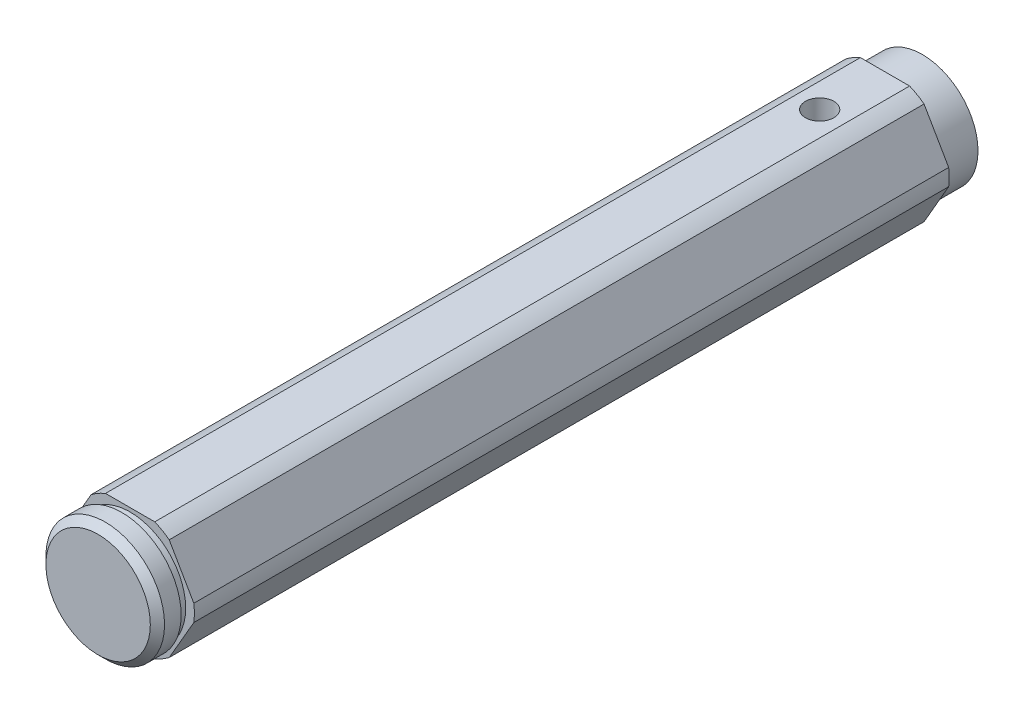
ISO-10303-21;
HEADER;
FILE_DESCRIPTION(('STEP AP214'),'2;1');
FILE_NAME('part.step','',(''),(''),'','','');
FILE_SCHEMA(('AUTOMOTIVE_DESIGN { 1 0 10303 214 1 1 1 1 }'));
ENDSEC;
DATA;
#1=APPLICATION_CONTEXT('core data for automotive mechanical design processes');
#2=APPLICATION_PROTOCOL_DEFINITION('international standard','automotive_design',2000,#1);
#3=PRODUCT_CONTEXT('',#1,'mechanical');
#4=PRODUCT('Part','Part','',(#3));
#5=PRODUCT_RELATED_PRODUCT_CATEGORY('part','',(#4));
#6=PRODUCT_DEFINITION_FORMATION('','',#4);
#7=PRODUCT_DEFINITION_CONTEXT('part definition',#1,'design');
#8=PRODUCT_DEFINITION('design','',#6,#7);
#9=PRODUCT_DEFINITION_SHAPE('','',#8);
#10=(LENGTH_UNIT() NAMED_UNIT(*) SI_UNIT(.MILLI.,.METRE.));
#11=(NAMED_UNIT(*) PLANE_ANGLE_UNIT() SI_UNIT($,.RADIAN.));
#12=(NAMED_UNIT(*) SI_UNIT($,.STERADIAN.) SOLID_ANGLE_UNIT());
#13=UNCERTAINTY_MEASURE_WITH_UNIT(LENGTH_MEASURE(1.E-05),#10,'distance_accuracy_value','');
#14=(GEOMETRIC_REPRESENTATION_CONTEXT(3) GLOBAL_UNCERTAINTY_ASSIGNED_CONTEXT((#13)) GLOBAL_UNIT_ASSIGNED_CONTEXT((#10,
#11,#12)) REPRESENTATION_CONTEXT('',''));
#15=CARTESIAN_POINT('',(0.,0.,0.));
#16=DIRECTION('',(0.,0.,1.));
#17=DIRECTION('',(1.,0.,0.));
#18=AXIS2_PLACEMENT_3D('',#15,#16,#17);
#19=CARTESIAN_POINT('',(0.,0.,7.99846));
#20=DIRECTION('',(0.,0.,-1.));
#21=DIRECTION('',(-1.,0.,0.));
#22=AXIS2_PLACEMENT_3D('',#19,#20,#21);
#23=PLANE('',#22);
#24=DIRECTION('',(0.,-1.,0.));
#25=VECTOR('',#24,1.);
#26=CARTESIAN_POINT('',(1.14402888188412,-6.34999999999999,7.99846));
#27=LINE('',#26,#25);
#28=CARTESIAN_POINT('',(1.14402888188412,3.57155750527903,7.99846));
#29=VERTEX_POINT('',#28);
#30=CARTESIAN_POINT('',(1.14402888188412,-3.57155750527903,7.99846));
#31=VERTEX_POINT('',#30);
#32=EDGE_CURVE('E140',#29,#31,#27,.T.);
#33=ORIENTED_EDGE('',*,*,#32,.F.);
#34=CARTESIAN_POINT('',(0.,0.,7.99846));
#35=DIRECTION('',(0.,0.,-1.));
#36=DIRECTION('',(-1.,0.,0.));
#37=AXIS2_PLACEMENT_3D('',#34,#35,#36);
#38=CIRCLE('',#37,3.75031);
#39=EDGE_CURVE('E148',#29,#31,#38,.T.);
#40=ORIENTED_EDGE('',*,*,#39,.T.);
#41=EDGE_LOOP('',(#33,#40));
#42=FACE_BOUND('',#41,.T.);
#43=ADVANCED_FACE('F35',(#42),#23,.T.);
#44=CARTESIAN_POINT('',(0.,0.,0.));
#45=DIRECTION('',(0.,0.,1.));
#46=DIRECTION('',(1.,0.,0.));
#47=AXIS2_PLACEMENT_3D('',#44,#45,#46);
#48=PLANE('',#47);
#49=DIRECTION('',(0.499999999999995,0.866025403784442,0.));
#50=VECTOR('',#49,1.);
#51=CARTESIAN_POINT('',(-3.66617420935415,6.34999999999997,0.));
#52=LINE('',#51,#50);
#53=CARTESIAN_POINT('',(-6.816751826331,0.893039494206721,0.));
#54=VERTEX_POINT('',#53);
#55=CARTESIAN_POINT('',(-4.18177080173139,5.4569605057932,0.));
#56=VERTEX_POINT('',#55);
#57=EDGE_CURVE('E199',#54,#56,#52,.T.);
#58=ORIENTED_EDGE('',*,*,#57,.T.);
#59=CARTESIAN_POINT('',(0.,0.,0.));
#60=DIRECTION('',(0.,0.,1.));
#61=DIRECTION('',(1.,0.,0.));
#62=AXIS2_PLACEMENT_3D('',#59,#60,#61);
#63=CIRCLE('',#62,6.875);
#64=CARTESIAN_POINT('',(-2.63498102459964,6.34999999999999,0.));
#65=VERTEX_POINT('',#64);
#66=EDGE_CURVE('E229',#65,#56,#63,.T.);
#67=ORIENTED_EDGE('',*,*,#66,.F.);
#68=DIRECTION('',(1.,0.,0.));
#69=VECTOR('',#68,1.);
#70=CARTESIAN_POINT('',(0.,6.35,0.));
#71=LINE('',#70,#69);
#72=CARTESIAN_POINT('',(2.63498102459961,6.35,0.));
#73=VERTEX_POINT('',#72);
#74=EDGE_CURVE('E205',#73,#65,#71,.F.);
#75=ORIENTED_EDGE('',*,*,#74,.F.);
#76=CARTESIAN_POINT('',(0.,0.,0.));
#77=DIRECTION('',(0.,0.,1.));
#78=DIRECTION('',(1.,0.,0.));
#79=AXIS2_PLACEMENT_3D('',#76,#77,#78);
#80=CIRCLE('',#79,6.875);
#81=CARTESIAN_POINT('',(4.18177080173135,5.45696050579323,0.));
#82=VERTEX_POINT('',#81);
#83=EDGE_CURVE('E209',#82,#73,#80,.T.);
#84=ORIENTED_EDGE('',*,*,#83,.F.);
#85=DIRECTION('',(-0.500000000000001,0.866025403784438,0.));
#86=VECTOR('',#85,1.);
#87=CARTESIAN_POINT('',(6.81675182633099,0.893039494206768,0.));
#88=LINE('',#87,#86);
#89=CARTESIAN_POINT('',(6.81675182633099,0.893039494206768,0.));
#90=VERTEX_POINT('',#89);
#91=EDGE_CURVE('E210',#90,#82,#88,.T.);
#92=ORIENTED_EDGE('',*,*,#91,.F.);
#93=CARTESIAN_POINT('',(0.,0.,0.));
#94=DIRECTION('',(0.,0.,1.));
#95=DIRECTION('',(1.,0.,0.));
#96=AXIS2_PLACEMENT_3D('',#93,#94,#95);
#97=CIRCLE('',#96,6.875);
#98=CARTESIAN_POINT('',(6.81675182633099,-0.893039494206785,0.));
#99=VERTEX_POINT('',#98);
#100=EDGE_CURVE('E194',#99,#90,#97,.T.);
#101=ORIENTED_EDGE('',*,*,#100,.F.);
#102=DIRECTION('',(0.499999999999995,0.866025403784442,0.));
#103=VECTOR('',#102,1.);
#104=CARTESIAN_POINT('',(4.18177080173144,-5.45696050579316,0.));
#105=LINE('',#104,#103);
#106=CARTESIAN_POINT('',(4.18177080173144,-5.45696050579316,0.));
#107=VERTEX_POINT('',#106);
#108=EDGE_CURVE('E213',#107,#99,#105,.T.);
#109=ORIENTED_EDGE('',*,*,#108,.F.);
#110=CARTESIAN_POINT('',(0.,0.,0.));
#111=DIRECTION('',(0.,0.,1.));
#112=DIRECTION('',(1.,0.,0.));
#113=AXIS2_PLACEMENT_3D('',#110,#111,#112);
#114=CIRCLE('',#113,6.875);
#115=CARTESIAN_POINT('',(2.63498102459963,-6.34999999999999,0.));
#116=VERTEX_POINT('',#115);
#117=EDGE_CURVE('E216',#116,#107,#114,.T.);
#118=ORIENTED_EDGE('',*,*,#117,.F.);
#119=DIRECTION('',(1.,0.,0.));
#120=VECTOR('',#119,1.);
#121=CARTESIAN_POINT('',(0.,-6.35000000000002,0.));
#122=LINE('',#121,#120);
#123=CARTESIAN_POINT('',(-2.63498102459956,-6.35000000000002,0.));
#124=VERTEX_POINT('',#123);
#125=EDGE_CURVE('E217',#124,#116,#122,.T.);
#126=ORIENTED_EDGE('',*,*,#125,.F.);
#127=CARTESIAN_POINT('',(0.,0.,0.));
#128=DIRECTION('',(0.,0.,1.));
#129=DIRECTION('',(1.,0.,0.));
#130=AXIS2_PLACEMENT_3D('',#127,#128,#129);
#131=CIRCLE('',#130,6.875);
#132=CARTESIAN_POINT('',(-4.18177080173132,-5.45696050579325,0.));
#133=VERTEX_POINT('',#132);
#134=EDGE_CURVE('E220',#133,#124,#131,.T.);
#135=ORIENTED_EDGE('',*,*,#134,.F.);
#136=DIRECTION('',(0.500000000000007,-0.866025403784434,0.));
#137=VECTOR('',#136,1.);
#138=CARTESIAN_POINT('',(-6.81675182633098,-0.893039494206822,0.));
#139=LINE('',#138,#137);
#140=CARTESIAN_POINT('',(-6.81675182633098,-0.893039494206821,0.));
#141=VERTEX_POINT('',#140);
#142=EDGE_CURVE('E221',#141,#133,#139,.T.);
#143=ORIENTED_EDGE('',*,*,#142,.F.);
#144=CARTESIAN_POINT('',(0.,0.,0.));
#145=DIRECTION('',(0.,0.,1.));
#146=DIRECTION('',(1.,0.,0.));
#147=AXIS2_PLACEMENT_3D('',#144,#145,#146);
#148=CIRCLE('',#147,6.875);
#149=EDGE_CURVE('E227',#54,#141,#148,.T.);
#150=ORIENTED_EDGE('',*,*,#149,.F.);
#151=EDGE_LOOP('',(#58,#67,#75,#84,#92,#101,#109,#118,#126,#135,#143,#150));
#152=FACE_BOUND('',#151,.T.);
#153=CARTESIAN_POINT('',(0.,0.,0.));
#154=DIRECTION('',(0.,0.,1.));
#155=DIRECTION('',(1.,0.,0.));
#156=AXIS2_PLACEMENT_3D('',#153,#154,#155);
#157=CIRCLE('',#156,5.95503);
#158=CARTESIAN_POINT('',(5.95503,0.,0.));
#159=VERTEX_POINT('',#158);
#160=EDGE_CURVE('E145',#159,#159,#157,.F.);
#161=ORIENTED_EDGE('',*,*,#160,.F.);
#162=EDGE_LOOP('',(#161));
#163=FACE_BOUND('',#162,.T.);
#164=ADVANCED_FACE('F283',(#152,#163),#48,.F.);
#165=CARTESIAN_POINT('',(0.,0.,80.7974));
#166=DIRECTION('',(0.,0.,1.));
#167=DIRECTION('',(1.,0.,0.));
#168=AXIS2_PLACEMENT_3D('',#165,#166,#167);
#169=PLANE('',#168);
#170=CARTESIAN_POINT('',(0.,0.,80.7974));
#171=DIRECTION('',(0.,0.,1.));
#172=DIRECTION('',(1.,0.,0.));
#173=AXIS2_PLACEMENT_3D('',#170,#171,#172);
#174=CIRCLE('',#173,6.875);
#175=CARTESIAN_POINT('',(4.18177080173135,5.45696050579323,80.7974));
#176=VERTEX_POINT('',#175);
#177=CARTESIAN_POINT('',(2.63498102459961,6.35,80.7974));
#178=VERTEX_POINT('',#177);
#179=EDGE_CURVE('E169',#176,#178,#174,.T.);
#180=ORIENTED_EDGE('',*,*,#179,.T.);
#181=DIRECTION('',(-1.,0.,0.));
#182=VECTOR('',#181,1.);
#183=CARTESIAN_POINT('',(2.63498102459961,6.35,80.7974));
#184=LINE('',#183,#182);
#185=CARTESIAN_POINT('',(-2.63498102459964,6.34999999999999,80.7974));
#186=VERTEX_POINT('',#185);
#187=EDGE_CURVE('E173',#178,#186,#184,.T.);
#188=ORIENTED_EDGE('',*,*,#187,.T.);
#189=CARTESIAN_POINT('',(0.,0.,80.7974));
#190=DIRECTION('',(0.,0.,1.));
#191=DIRECTION('',(1.,0.,0.));
#192=AXIS2_PLACEMENT_3D('',#189,#190,#191);
#193=CIRCLE('',#192,6.875);
#194=CARTESIAN_POINT('',(-4.18177080173139,5.4569605057932,80.7974));
#195=VERTEX_POINT('',#194);
#196=EDGE_CURVE('E63',#186,#195,#193,.T.);
#197=ORIENTED_EDGE('',*,*,#196,.T.);
#198=DIRECTION('',(-0.499999999999995,-0.866025403784441,0.));
#199=VECTOR('',#198,1.);
#200=CARTESIAN_POINT('',(-4.18177080173139,5.4569605057932,80.7974));
#201=LINE('',#200,#199);
#202=CARTESIAN_POINT('',(-6.816751826331,0.893039494206721,80.7974));
#203=VERTEX_POINT('',#202);
#204=EDGE_CURVE('E176',#195,#203,#201,.T.);
#205=ORIENTED_EDGE('',*,*,#204,.T.);
#206=CARTESIAN_POINT('',(0.,0.,80.7974));
#207=DIRECTION('',(0.,0.,1.));
#208=DIRECTION('',(1.,0.,0.));
#209=AXIS2_PLACEMENT_3D('',#206,#207,#208);
#210=CIRCLE('',#209,6.875);
#211=CARTESIAN_POINT('',(-6.81675182633098,-0.893039494206818,80.7974));
#212=VERTEX_POINT('',#211);
#213=EDGE_CURVE('E178',#203,#212,#210,.T.);
#214=ORIENTED_EDGE('',*,*,#213,.T.);
#215=DIRECTION('',(0.500000000000007,-0.866025403784434,0.));
#216=VECTOR('',#215,1.);
#217=CARTESIAN_POINT('',(-6.81675182633098,-0.893039494206821,80.7974));
#218=LINE('',#217,#216);
#219=CARTESIAN_POINT('',(-4.18177080173132,-5.45696050579326,80.7974));
#220=VERTEX_POINT('',#219);
#221=EDGE_CURVE('E180',#212,#220,#218,.T.);
#222=ORIENTED_EDGE('',*,*,#221,.T.);
#223=CARTESIAN_POINT('',(0.,0.,80.7974));
#224=DIRECTION('',(0.,0.,1.));
#225=DIRECTION('',(1.,0.,0.));
#226=AXIS2_PLACEMENT_3D('',#223,#224,#225);
#227=CIRCLE('',#226,6.875);
#228=CARTESIAN_POINT('',(-2.63498102459957,-6.35000000000001,80.7974));
#229=VERTEX_POINT('',#228);
#230=EDGE_CURVE('E182',#220,#229,#227,.T.);
#231=ORIENTED_EDGE('',*,*,#230,.T.);
#232=DIRECTION('',(1.,0.,0.));
#233=VECTOR('',#232,1.);
#234=CARTESIAN_POINT('',(-2.63498102459957,-6.35000000000001,80.7974));
#235=LINE('',#234,#233);
#236=CARTESIAN_POINT('',(2.63498102459963,-6.34999999999999,80.7974));
#237=VERTEX_POINT('',#236);
#238=EDGE_CURVE('E184',#229,#237,#235,.T.);
#239=ORIENTED_EDGE('',*,*,#238,.T.);
#240=CARTESIAN_POINT('',(0.,0.,80.7974));
#241=DIRECTION('',(0.,0.,1.));
#242=DIRECTION('',(1.,0.,0.));
#243=AXIS2_PLACEMENT_3D('',#240,#241,#242);
#244=CIRCLE('',#243,6.875);
#245=CARTESIAN_POINT('',(4.18177080173144,-5.45696050579316,80.7974));
#246=VERTEX_POINT('',#245);
#247=EDGE_CURVE('E186',#237,#246,#244,.T.);
#248=ORIENTED_EDGE('',*,*,#247,.T.);
#249=DIRECTION('',(0.499999999999995,0.866025403784441,0.));
#250=VECTOR('',#249,1.);
#251=CARTESIAN_POINT('',(4.18177080173144,-5.45696050579316,80.7974));
#252=LINE('',#251,#250);
#253=CARTESIAN_POINT('',(6.81675182633099,-0.893039494206787,80.7974));
#254=VERTEX_POINT('',#253);
#255=EDGE_CURVE('E188',#246,#254,#252,.T.);
#256=ORIENTED_EDGE('',*,*,#255,.T.);
#257=CARTESIAN_POINT('',(0.,0.,80.7974));
#258=DIRECTION('',(0.,0.,1.));
#259=DIRECTION('',(1.,0.,0.));
#260=AXIS2_PLACEMENT_3D('',#257,#258,#259);
#261=CIRCLE('',#260,6.875);
#262=CARTESIAN_POINT('',(6.81675182633099,0.893039494206768,80.7974));
#263=VERTEX_POINT('',#262);
#264=EDGE_CURVE('E190',#254,#263,#261,.T.);
#265=ORIENTED_EDGE('',*,*,#264,.T.);
#266=DIRECTION('',(-0.500000000000001,0.866025403784438,0.));
#267=VECTOR('',#266,1.);
#268=CARTESIAN_POINT('',(6.81675182633099,0.893039494206768,80.7974));
#269=LINE('',#268,#267);
#270=EDGE_CURVE('E192',#263,#176,#269,.T.);
#271=ORIENTED_EDGE('',*,*,#270,.T.);
#272=EDGE_LOOP('',(#180,#188,#197,#205,#214,#222,#231,#239,#248,#256,#265,#271));
#273=FACE_BOUND('',#272,.T.);
#274=CARTESIAN_POINT('',(0.,0.,80.7974));
#275=DIRECTION('',(0.,0.,1.));
#276=DIRECTION('',(1.,0.,0.));
#277=AXIS2_PLACEMENT_3D('',#274,#275,#276);
#278=CIRCLE('',#277,5.9436);
#279=CARTESIAN_POINT('',(5.9436,0.,80.7974));
#280=VERTEX_POINT('',#279);
#281=EDGE_CURVE('E165',#280,#280,#278,.T.);
#282=ORIENTED_EDGE('',*,*,#281,.F.);
#283=EDGE_LOOP('',(#282));
#284=FACE_BOUND('',#283,.T.);
#285=ADVANCED_FACE('F289',(#273,#284),#169,.T.);
#286=CARTESIAN_POINT('',(0.,0.,0.));
#287=DIRECTION('',(0.,0.,1.));
#288=DIRECTION('',(1.,0.,0.));
#289=AXIS2_PLACEMENT_3D('',#286,#287,#288);
#290=CYLINDRICAL_SURFACE('',#289,6.875);
#291=DIRECTION('',(0.,0.,1.));
#292=VECTOR('',#291,1.);
#293=CARTESIAN_POINT('',(6.81675182633099,0.893039494206768,7.9375));
#294=LINE('',#293,#292);
#295=EDGE_CURVE('E235',#90,#263,#294,.T.);
#296=ORIENTED_EDGE('',*,*,#295,.T.);
#297=ORIENTED_EDGE('',*,*,#264,.F.);
#298=DIRECTION('',(0.,0.,1.));
#299=VECTOR('',#298,1.);
#300=CARTESIAN_POINT('',(6.81675182633099,-0.893039494206785,7.9375));
#301=LINE('',#300,#299);
#302=EDGE_CURVE('E241',#254,#99,#301,.F.);
#303=ORIENTED_EDGE('',*,*,#302,.T.);
#304=ORIENTED_EDGE('',*,*,#100,.T.);
#305=EDGE_LOOP('',(#296,#297,#303,#304));
#306=FACE_BOUND('',#305,.T.);
#307=ADVANCED_FACE('F295',(#306),#290,.T.);
#308=CARTESIAN_POINT('',(0.,0.,0.));
#309=DIRECTION('',(0.,0.,1.));
#310=DIRECTION('',(1.,0.,0.));
#311=AXIS2_PLACEMENT_3D('',#308,#309,#310);
#312=CYLINDRICAL_SURFACE('',#311,6.875);
#313=DIRECTION('',(0.,0.,1.));
#314=VECTOR('',#313,1.);
#315=CARTESIAN_POINT('',(-2.63498102459957,-6.35000000000001,7.9375));
#316=LINE('',#315,#314);
#317=EDGE_CURVE('E245',#124,#229,#316,.T.);
#318=ORIENTED_EDGE('',*,*,#317,.T.);
#319=ORIENTED_EDGE('',*,*,#230,.F.);
#320=DIRECTION('',(0.,0.,1.));
#321=VECTOR('',#320,1.);
#322=CARTESIAN_POINT('',(-4.18177080173132,-5.45696050579326,7.9375));
#323=LINE('',#322,#321);
#324=EDGE_CURVE('E224',#220,#133,#323,.F.);
#325=ORIENTED_EDGE('',*,*,#324,.T.);
#326=ORIENTED_EDGE('',*,*,#134,.T.);
#327=EDGE_LOOP('',(#318,#319,#325,#326));
#328=FACE_BOUND('',#327,.T.);
#329=ADVANCED_FACE('F329',(#328),#312,.T.);
#330=CARTESIAN_POINT('',(-3.66617420935406,-6.35000000000002,7.9375));
#331=DIRECTION('',(0.,1.,0.));
#332=DIRECTION('',(-1.,0.,0.));
#333=AXIS2_PLACEMENT_3D('',#330,#331,#332);
#334=PLANE('',#333);
#335=CARTESIAN_POINT('',(0.,-6.34999999999999,6.99159659446025));
#336=DIRECTION('',(0.,-1.,0.));
#337=DIRECTION('',(0.,0.,-1.));
#338=AXIS2_PLACEMENT_3D('',#335,#336,#337);
#339=CIRCLE('',#338,1.524);
#340=CARTESIAN_POINT('',(0.,-6.34999999999999,5.46759659446025));
#341=VERTEX_POINT('',#340);
#342=EDGE_CURVE('E561',#341,#341,#339,.T.);
#343=ORIENTED_EDGE('',*,*,#342,.F.);
#344=EDGE_LOOP('',(#343));
#345=FACE_BOUND('',#344,.T.);
#346=ORIENTED_EDGE('',*,*,#238,.F.);
#347=ORIENTED_EDGE('',*,*,#317,.F.);
#348=ORIENTED_EDGE('',*,*,#125,.T.);
#349=DIRECTION('',(0.,0.,1.));
#350=VECTOR('',#349,1.);
#351=CARTESIAN_POINT('',(2.6349810245997,-6.34999999999996,0.));
#352=LINE('',#351,#350);
#353=EDGE_CURVE('E243',#237,#116,#352,.F.);
#354=ORIENTED_EDGE('',*,*,#353,.F.);
#355=EDGE_LOOP('',(#346,#347,#348,#354));
#356=FACE_BOUND('',#355,.T.);
#357=ADVANCED_FACE('F325',(#345,#356),#334,.F.);
#358=CARTESIAN_POINT('',(0.,0.,0.));
#359=DIRECTION('',(0.,0.,1.));
#360=DIRECTION('',(1.,0.,0.));
#361=AXIS2_PLACEMENT_3D('',#358,#359,#360);
#362=CYLINDRICAL_SURFACE('',#361,6.875);
#363=DIRECTION('',(0.,0.,1.));
#364=VECTOR('',#363,1.);
#365=CARTESIAN_POINT('',(4.18177080173144,-5.45696050579316,7.9375));
#366=LINE('',#365,#364);
#367=EDGE_CURVE('E238',#107,#246,#366,.T.);
#368=ORIENTED_EDGE('',*,*,#367,.T.);
#369=ORIENTED_EDGE('',*,*,#247,.F.);
#370=ORIENTED_EDGE('',*,*,#353,.T.);
#371=ORIENTED_EDGE('',*,*,#117,.T.);
#372=EDGE_LOOP('',(#368,#369,#370,#371));
#373=FACE_BOUND('',#372,.T.);
#374=ADVANCED_FACE('F321',(#373),#362,.T.);
#375=CARTESIAN_POINT('',(3.66617420935419,-6.34999999999995,7.9375));
#376=DIRECTION('',(-0.866025403784441,0.499999999999995,0.));
#377=DIRECTION('',(-0.499999999999995,-0.866025403784441,0.));
#378=AXIS2_PLACEMENT_3D('',#375,#376,#377);
#379=PLANE('',#378);
#380=ORIENTED_EDGE('',*,*,#255,.F.);
#381=ORIENTED_EDGE('',*,*,#367,.F.);
#382=ORIENTED_EDGE('',*,*,#108,.T.);
#383=ORIENTED_EDGE('',*,*,#302,.F.);
#384=EDGE_LOOP('',(#380,#381,#382,#383));
#385=FACE_BOUND('',#384,.T.);
#386=ADVANCED_FACE('F317',(#385),#379,.F.);
#387=CARTESIAN_POINT('',(7.33234841870824,0.,7.9375));
#388=DIRECTION('',(-0.866025403784438,-0.500000000000001,0.));
#389=DIRECTION('',(0.500000000000001,-0.866025403784438,0.));
#390=AXIS2_PLACEMENT_3D('',#387,#388,#389);
#391=PLANE('',#390);
#392=ORIENTED_EDGE('',*,*,#270,.F.);
#393=ORIENTED_EDGE('',*,*,#295,.F.);
#394=ORIENTED_EDGE('',*,*,#91,.T.);
#395=DIRECTION('',(0.,0.,1.));
#396=VECTOR('',#395,1.);
#397=CARTESIAN_POINT('',(4.18177080173135,5.45696050579323,0.));
#398=LINE('',#397,#396);
#399=EDGE_CURVE('E233',#176,#82,#398,.F.);
#400=ORIENTED_EDGE('',*,*,#399,.F.);
#401=EDGE_LOOP('',(#392,#393,#394,#400));
#402=FACE_BOUND('',#401,.T.);
#403=ADVANCED_FACE('F313',(#402),#391,.F.);
#404=CARTESIAN_POINT('',(0.,0.,0.));
#405=DIRECTION('',(0.,0.,1.));
#406=DIRECTION('',(1.,0.,0.));
#407=AXIS2_PLACEMENT_3D('',#404,#405,#406);
#408=CYLINDRICAL_SURFACE('',#407,6.875);
#409=DIRECTION('',(0.,0.,1.));
#410=VECTOR('',#409,1.);
#411=CARTESIAN_POINT('',(2.63498102459961,6.35,7.9375));
#412=LINE('',#411,#410);
#413=EDGE_CURVE('E230',#73,#178,#412,.T.);
#414=ORIENTED_EDGE('',*,*,#413,.T.);
#415=ORIENTED_EDGE('',*,*,#179,.F.);
#416=ORIENTED_EDGE('',*,*,#399,.T.);
#417=ORIENTED_EDGE('',*,*,#83,.T.);
#418=EDGE_LOOP('',(#414,#415,#416,#417));
#419=FACE_BOUND('',#418,.T.);
#420=ADVANCED_FACE('F309',(#419),#408,.T.);
#421=CARTESIAN_POINT('',(3.6661742093541,6.35,7.9375));
#422=DIRECTION('',(0.,-1.,0.));
#423=DIRECTION('',(1.,0.,0.));
#424=AXIS2_PLACEMENT_3D('',#421,#422,#423);
#425=PLANE('',#424);
#426=CARTESIAN_POINT('',(0.,6.35000000000007,6.99159659446025));
#427=DIRECTION('',(0.,-1.,0.));
#428=DIRECTION('',(0.,0.,-1.));
#429=AXIS2_PLACEMENT_3D('',#426,#427,#428);
#430=CIRCLE('',#429,1.524);
#431=CARTESIAN_POINT('',(0.,6.35000000000007,5.46759659446025));
#432=VERTEX_POINT('',#431);
#433=EDGE_CURVE('E562',#432,#432,#430,.T.);
#434=ORIENTED_EDGE('',*,*,#433,.T.);
#435=EDGE_LOOP('',(#434));
#436=FACE_BOUND('',#435,.T.);
#437=ORIENTED_EDGE('',*,*,#187,.F.);
#438=ORIENTED_EDGE('',*,*,#413,.F.);
#439=ORIENTED_EDGE('',*,*,#74,.T.);
#440=DIRECTION('',(0.,0.,1.));
#441=VECTOR('',#440,1.);
#442=CARTESIAN_POINT('',(-2.63498102459966,6.34999999999998,0.));
#443=LINE('',#442,#441);
#444=EDGE_CURVE('E208',#186,#65,#443,.F.);
#445=ORIENTED_EDGE('',*,*,#444,.F.);
#446=EDGE_LOOP('',(#437,#438,#439,#445));
#447=FACE_BOUND('',#446,.T.);
#448=ADVANCED_FACE('F305',(#436,#447),#425,.F.);
#449=CARTESIAN_POINT('',(-7.33234841870824,0.,7.9375));
#450=DIRECTION('',(0.866025403784435,0.500000000000007,0.));
#451=DIRECTION('',(-0.500000000000007,0.866025403784435,0.));
#452=AXIS2_PLACEMENT_3D('',#449,#450,#451);
#453=PLANE('',#452);
#454=ORIENTED_EDGE('',*,*,#221,.F.);
#455=DIRECTION('',(0.,0.,1.));
#456=VECTOR('',#455,1.);
#457=CARTESIAN_POINT('',(-6.81675182633098,-0.893039494206821,0.));
#458=LINE('',#457,#456);
#459=EDGE_CURVE('E204',#141,#212,#458,.T.);
#460=ORIENTED_EDGE('',*,*,#459,.F.);
#461=ORIENTED_EDGE('',*,*,#142,.T.);
#462=ORIENTED_EDGE('',*,*,#324,.F.);
#463=EDGE_LOOP('',(#454,#460,#461,#462));
#464=FACE_BOUND('',#463,.T.);
#465=ADVANCED_FACE('F302',(#464),#453,.F.);
#466=CARTESIAN_POINT('',(0.,0.,0.));
#467=DIRECTION('',(0.,0.,1.));
#468=DIRECTION('',(1.,0.,0.));
#469=AXIS2_PLACEMENT_3D('',#466,#467,#468);
#470=CYLINDRICAL_SURFACE('',#469,6.875);
#471=DIRECTION('',(0.,0.,1.));
#472=VECTOR('',#471,1.);
#473=CARTESIAN_POINT('',(-4.18177080173139,5.4569605057932,7.9375));
#474=LINE('',#473,#472);
#475=EDGE_CURVE('E195',#56,#195,#474,.T.);
#476=ORIENTED_EDGE('',*,*,#475,.T.);
#477=ORIENTED_EDGE('',*,*,#196,.F.);
#478=ORIENTED_EDGE('',*,*,#444,.T.);
#479=ORIENTED_EDGE('',*,*,#66,.T.);
#480=EDGE_LOOP('',(#476,#477,#478,#479));
#481=FACE_BOUND('',#480,.T.);
#482=ADVANCED_FACE('F300',(#481),#470,.T.);
#483=CARTESIAN_POINT('',(0.,0.,0.));
#484=DIRECTION('',(0.,0.,1.));
#485=DIRECTION('',(1.,0.,0.));
#486=AXIS2_PLACEMENT_3D('',#483,#484,#485);
#487=CYLINDRICAL_SURFACE('',#486,6.875);
#488=ORIENTED_EDGE('',*,*,#459,.T.);
#489=ORIENTED_EDGE('',*,*,#213,.F.);
#490=DIRECTION('',(0.,0.,1.));
#491=VECTOR('',#490,1.);
#492=CARTESIAN_POINT('',(-6.816751826331,0.893039494206722,7.9375));
#493=LINE('',#492,#491);
#494=EDGE_CURVE('E198',#203,#54,#493,.F.);
#495=ORIENTED_EDGE('',*,*,#494,.T.);
#496=ORIENTED_EDGE('',*,*,#149,.T.);
#497=EDGE_LOOP('',(#488,#489,#495,#496));
#498=FACE_BOUND('',#497,.T.);
#499=ADVANCED_FACE('F363',(#498),#487,.T.);
#500=CARTESIAN_POINT('',(-3.66617420935415,6.34999999999997,7.9375));
#501=DIRECTION('',(0.866025403784442,-0.499999999999995,0.));
#502=DIRECTION('',(0.499999999999995,0.866025403784442,0.));
#503=AXIS2_PLACEMENT_3D('',#500,#501,#502);
#504=PLANE('',#503);
#505=ORIENTED_EDGE('',*,*,#204,.F.);
#506=ORIENTED_EDGE('',*,*,#475,.F.);
#507=ORIENTED_EDGE('',*,*,#57,.F.);
#508=ORIENTED_EDGE('',*,*,#494,.F.);
#509=EDGE_LOOP('',(#505,#506,#507,#508));
#510=FACE_BOUND('',#509,.T.);
#511=ADVANCED_FACE('F357',(#510),#504,.F.);
#512=CARTESIAN_POINT('',(0.,0.,81.6864));
#513=DIRECTION('',(0.,0.,-1.));
#514=DIRECTION('',(-1.,0.,0.));
#515=AXIS2_PLACEMENT_3D('',#512,#513,#514);
#516=CYLINDRICAL_SURFACE('',#515,5.9436);
#517=CARTESIAN_POINT('',(0.,0.,81.6864));
#518=DIRECTION('',(0.,0.,1.));
#519=DIRECTION('',(1.,0.,0.));
#520=AXIS2_PLACEMENT_3D('',#517,#518,#519);
#521=CIRCLE('',#520,5.9436);
#522=CARTESIAN_POINT('',(5.9436,0.,81.6864));
#523=VERTEX_POINT('',#522);
#524=EDGE_CURVE('E166',#523,#523,#521,.T.);
#525=ORIENTED_EDGE('',*,*,#524,.F.);
#526=EDGE_LOOP('',(#525));
#527=FACE_BOUND('',#526,.T.);
#528=ORIENTED_EDGE('',*,*,#281,.T.);
#529=EDGE_LOOP('',(#528));
#530=FACE_BOUND('',#529,.T.);
#531=ADVANCED_FACE('F380',(#527,#530),#516,.T.);
#532=CARTESIAN_POINT('',(0.,0.,81.6864));
#533=DIRECTION('',(0.,0.,1.));
#534=DIRECTION('',(1.,0.,0.));
#535=AXIS2_PLACEMENT_3D('',#532,#533,#534);
#536=PLANE('',#535);
#537=CARTESIAN_POINT('',(0.,0.,81.6864));
#538=DIRECTION('',(0.,0.,1.));
#539=DIRECTION('',(1.,0.,0.));
#540=AXIS2_PLACEMENT_3D('',#537,#538,#539);
#541=CIRCLE('',#540,6.35);
#542=CARTESIAN_POINT('',(6.35,0.,81.6864));
#543=VERTEX_POINT('',#542);
#544=EDGE_CURVE('E157',#543,#543,#541,.T.);
#545=ORIENTED_EDGE('',*,*,#544,.F.);
#546=EDGE_LOOP('',(#545));
#547=FACE_BOUND('',#546,.T.);
#548=ORIENTED_EDGE('',*,*,#524,.T.);
#549=EDGE_LOOP('',(#548));
#550=FACE_BOUND('',#549,.T.);
#551=ADVANCED_FACE('F385',(#547,#550),#536,.F.);
#552=CARTESIAN_POINT('',(0.,0.,84.2264));
#553=DIRECTION('',(0.,0.,-1.));
#554=DIRECTION('',(-1.,0.,0.));
#555=AXIS2_PLACEMENT_3D('',#552,#553,#554);
#556=CYLINDRICAL_SURFACE('',#555,6.35);
#557=CARTESIAN_POINT('',(0.,0.,83.4644));
#558=DIRECTION('',(0.,0.,1.));
#559=DIRECTION('',(1.,0.,0.));
#560=AXIS2_PLACEMENT_3D('',#557,#558,#559);
#561=CIRCLE('',#560,6.35);
#562=CARTESIAN_POINT('',(6.35,0.,83.4644));
#563=VERTEX_POINT('',#562);
#564=EDGE_CURVE('E261',#563,#563,#561,.F.);
#565=ORIENTED_EDGE('',*,*,#564,.T.);
#566=EDGE_LOOP('',(#565));
#567=FACE_BOUND('',#566,.T.);
#568=ORIENTED_EDGE('',*,*,#544,.T.);
#569=EDGE_LOOP('',(#568));
#570=FACE_BOUND('',#569,.T.);
#571=ADVANCED_FACE('F387',(#567,#570),#556,.T.);
#572=CARTESIAN_POINT('',(0.,0.,84.2264));
#573=DIRECTION('',(0.,0.,1.));
#574=DIRECTION('',(1.,0.,0.));
#575=AXIS2_PLACEMENT_3D('',#572,#573,#574);
#576=PLANE('',#575);
#577=CARTESIAN_POINT('',(0.,0.,84.2264));
#578=DIRECTION('',(0.,0.,1.));
#579=DIRECTION('',(1.,0.,0.));
#580=AXIS2_PLACEMENT_3D('',#577,#578,#579);
#581=CIRCLE('',#580,5.58800000000002);
#582=CARTESIAN_POINT('',(5.58800000000002,0.,84.2264));
#583=VERTEX_POINT('',#582);
#584=EDGE_CURVE('E201',#583,#583,#581,.T.);
#585=ORIENTED_EDGE('',*,*,#584,.T.);
#586=EDGE_LOOP('',(#585));
#587=FACE_BOUND('',#586,.T.);
#588=ADVANCED_FACE('F390',(#587),#576,.T.);
#589=CARTESIAN_POINT('',(0.,0.,84.2264));
#590=DIRECTION('',(0.,0.,-1.));
#591=DIRECTION('',(-1.,0.,0.));
#592=AXIS2_PLACEMENT_3D('',#589,#590,#591);
#593=CONICAL_SURFACE('',#592,5.58800000000002,0.785398163397447);
#594=ORIENTED_EDGE('',*,*,#564,.F.);
#595=EDGE_LOOP('',(#594));
#596=FACE_BOUND('',#595,.T.);
#597=ORIENTED_EDGE('',*,*,#584,.F.);
#598=EDGE_LOOP('',(#597));
#599=FACE_BOUND('',#598,.T.);
#600=ADVANCED_FACE('F37',(#596,#599),#593,.T.);
#601=CARTESIAN_POINT('',(0.,0.,-4.0005));
#602=DIRECTION('',(0.,0.,1.));
#603=DIRECTION('',(1.,0.,0.));
#604=AXIS2_PLACEMENT_3D('',#601,#602,#603);
#605=CYLINDRICAL_SURFACE('',#604,5.95503);
#606=CARTESIAN_POINT('',(0.,0.,-4.0005));
#607=DIRECTION('',(0.,0.,-1.));
#608=DIRECTION('',(-1.,0.,0.));
#609=AXIS2_PLACEMENT_3D('',#606,#607,#608);
#610=CIRCLE('',#609,5.95503);
#611=CARTESIAN_POINT('',(-5.95503,0.,-4.0005));
#612=VERTEX_POINT('',#611);
#613=EDGE_CURVE('E153',#612,#612,#610,.T.);
#614=ORIENTED_EDGE('',*,*,#613,.F.);
#615=EDGE_LOOP('',(#614));
#616=FACE_BOUND('',#615,.T.);
#617=ORIENTED_EDGE('',*,*,#160,.T.);
#618=EDGE_LOOP('',(#617));
#619=FACE_BOUND('',#618,.T.);
#620=ADVANCED_FACE('F398',(#616,#619),#605,.T.);
#621=CARTESIAN_POINT('',(0.,0.,-4.0005));
#622=DIRECTION('',(0.,0.,-1.));
#623=DIRECTION('',(-1.,0.,0.));
#624=AXIS2_PLACEMENT_3D('',#621,#622,#623);
#625=PLANE('',#624);
#626=CARTESIAN_POINT('',(0.,0.,-4.0005));
#627=DIRECTION('',(0.,0.,-1.));
#628=DIRECTION('',(-1.,0.,0.));
#629=AXIS2_PLACEMENT_3D('',#626,#627,#628);
#630=CIRCLE('',#629,3.75031);
#631=CARTESIAN_POINT('',(-3.75031,0.,-4.0005));
#632=VERTEX_POINT('',#631);
#633=EDGE_CURVE('E149',#632,#632,#630,.T.);
#634=ORIENTED_EDGE('',*,*,#633,.F.);
#635=EDGE_LOOP('',(#634));
#636=FACE_BOUND('',#635,.T.);
#637=ORIENTED_EDGE('',*,*,#613,.T.);
#638=EDGE_LOOP('',(#637));
#639=FACE_BOUND('',#638,.T.);
#640=ADVANCED_FACE('F281',(#636,#639),#625,.T.);
#641=CARTESIAN_POINT('',(0.,0.,7.99846));
#642=DIRECTION('',(0.,0.,-1.));
#643=DIRECTION('',(-1.,0.,0.));
#644=AXIS2_PLACEMENT_3D('',#641,#642,#643);
#645=CYLINDRICAL_SURFACE('',#644,3.75031);
#646=CARTESIAN_POINT('',(-1.14402888188399,-3.57155750527907,7.99846));
#647=VERTEX_POINT('',#646);
#648=CARTESIAN_POINT('',(-1.14402888188399,3.57155750527907,7.99846));
#649=VERTEX_POINT('',#648);
#650=EDGE_CURVE('E154',#647,#649,#38,.T.);
#651=ORIENTED_EDGE('',*,*,#650,.F.);
#652=CARTESIAN_POINT('',(-1.14402888188399,-3.57155750527907,7.99846));
#653=CARTESIAN_POINT('',(-1.19925180564522,-3.55385803103271,7.93577377847216));
#654=CARTESIAN_POINT('',(-1.24933765962475,-3.53640829372275,7.86840732371237));
#655=CARTESIAN_POINT('',(-1.33813492445363,-3.50378248474357,7.72577609217929));
#656=CARTESIAN_POINT('',(-1.3768115833573,-3.48861342735001,7.65048811260381));
#657=CARTESIAN_POINT('',(-1.4414215713115,-3.46241975446941,7.49368136102322));
#658=CARTESIAN_POINT('',(-1.46732328351075,-3.4514054372643,7.41214770138381));
#659=CARTESIAN_POINT('',(-1.50512566992622,-3.43509204387212,7.24547211641361));
#660=CARTESIAN_POINT('',(-1.5170526578054,-3.42978222798463,7.16033728624108));
#661=CARTESIAN_POINT('',(-1.52613977430157,-3.4257469788876,6.99405077556076));
#662=CARTESIAN_POINT('',(-1.52410923651393,-3.42666064517489,6.91295139917597));
#663=CARTESIAN_POINT('',(-1.50726561892596,-3.43410220367183,6.75232594048018));
#664=CARTESIAN_POINT('',(-1.4924467130504,-3.44063265475002,6.67280059215293));
#665=CARTESIAN_POINT('',(-1.45113635701439,-3.4582527474537,6.51942737440418));
#666=CARTESIAN_POINT('',(-1.42492591516496,-3.46923222398566,6.44549023541176));
#667=CARTESIAN_POINT('',(-1.36178253106436,-3.49449927712703,6.30297219858587));
#668=CARTESIAN_POINT('',(-1.32484775798032,-3.50878741849959,6.23439221785301));
#669=CARTESIAN_POINT('',(-1.2383114930652,-3.54029222746229,6.09939270641075));
#670=CARTESIAN_POINT('',(-1.18800812563332,-3.55764340517692,6.03345449670139));
#671=CARTESIAN_POINT('',(-1.07743859249052,-3.59267487794883,5.91060770795587));
#672=CARTESIAN_POINT('',(-1.0171680895231,-3.61035531329906,5.85370308115735));
#673=CARTESIAN_POINT('',(-0.884255258871981,-3.64525652749071,5.74728210744179));
#674=CARTESIAN_POINT('',(-0.811104002768571,-3.66239386289028,5.69837065018973));
#675=CARTESIAN_POINT('',(-0.656901203890307,-3.69316601414464,5.61363091009431));
#676=CARTESIAN_POINT('',(-0.575851910752083,-3.706801823357,5.57779891548379));
#677=CARTESIAN_POINT('',(-0.411007177940036,-3.72861465731472,5.52157344838402));
#678=CARTESIAN_POINT('',(-0.32740171836683,-3.736963111943,5.50069191341408));
#679=CARTESIAN_POINT('',(-0.157513793972489,-3.74796556800274,5.47332182690622));
#680=CARTESIAN_POINT('',(-0.0712326330964868,-3.7506223002706,5.46682637300736));
#681=CARTESIAN_POINT('',(0.095484470192699,-3.74996052388023,5.46845819073773));
#682=CARTESIAN_POINT('',(0.175932857965553,-3.74702225169459,5.47565491385975));
#683=CARTESIAN_POINT('',(0.334358379473629,-3.73621924099472,5.5025579335158));
#684=CARTESIAN_POINT('',(0.412335505861088,-3.72835448783411,5.52226426724081));
#685=CARTESIAN_POINT('',(0.563591350733702,-3.70850420050109,5.57339177367629));
#686=CARTESIAN_POINT('',(0.636879057606153,-3.69652684802384,5.60478969727888));
#687=CARTESIAN_POINT('',(0.777258767781788,-3.66957894809524,5.67830752787281));
#688=CARTESIAN_POINT('',(0.844348971098869,-3.65460753502793,5.72043053656888));
#689=CARTESIAN_POINT('',(0.974946236593896,-3.62203195627636,5.81725792916579));
#690=CARTESIAN_POINT('',(1.03796480478192,-3.60432156893349,5.87258561619864));
#691=CARTESIAN_POINT('',(1.15411682019705,-3.56882826503561,5.99280631836726));
#692=CARTESIAN_POINT('',(1.20724614416265,-3.55104532137249,6.05770330324405));
#693=CARTESIAN_POINT('',(1.30452782805086,-3.51650713422306,6.198842860023));
#694=CARTESIAN_POINT('',(1.34815619964454,-3.4998365298179,6.2754694735319));
#695=CARTESIAN_POINT('',(1.42175455986384,-3.47059349738174,6.43575736722608));
#696=CARTESIAN_POINT('',(1.45172965614535,-3.45801953730845,6.51941600285304));
#697=CARTESIAN_POINT('',(1.4957312097645,-3.43921001365428,6.68737825558633));
#698=CARTESIAN_POINT('',(1.51042688846071,-3.43270987872617,6.77147580654001));
#699=CARTESIAN_POINT('',(1.52553968453803,-3.42602231749818,6.94114209741463));
#700=CARTESIAN_POINT('',(1.52596971451776,-3.42582918239926,7.0267094367426));
#701=CARTESIAN_POINT('',(1.51305698502331,-3.43154778676642,7.19027430483986));
#702=CARTESIAN_POINT('',(1.50071463503337,-3.43701610187312,7.26836941208987));
#703=CARTESIAN_POINT('',(1.46426682686724,-3.45269980662187,7.42135682709195));
#704=CARTESIAN_POINT('',(1.4401455872196,-3.46292156409371,7.49624469091792));
#705=CARTESIAN_POINT('',(1.3782588701725,-3.48804277241087,7.64753045512451));
#706=CARTESIAN_POINT('',(1.33944895026235,-3.5032840276025,7.72344225521789));
#707=CARTESIAN_POINT('',(1.2501603678932,-3.53612106702378,7.86730419023477));
#708=CARTESIAN_POINT('',(1.19970379773717,-3.55371236721661,7.93526903641407));
#709=CARTESIAN_POINT('',(1.14402888188412,-3.57155750527903,7.99846));
#710=B_SPLINE_CURVE_WITH_KNOTS('',3,(#652,#653,#654,#655,#656,#657,#658,#659,#660,#661,#662,
#663,#664,#665,#666,#667,#668,#669,#670,#671,#672,#673,#674,#675,#676,#677,#678,#679,#680,#681,
#682,#683,#684,#685,#686,#687,#688,#689,#690,#691,#692,#693,#694,#695,#696,#697,#698,#699,#700,
#701,#702,#703,#704,#705,#706,#707,#708,#709),.UNSPECIFIED.,.F.,.F.,(4,2,2,2,2,2,2,2,2,2,2,2,2,
2,2,2,2,2,2,2,2,2,2,2,2,2,2,2,4),(0.,0.256015798458697,0.512803543924119,0.770223666337287,
1.02715829740607,1.26932546324436,1.51160301293991,1.74821603808807,1.984869481035,
2.23796854242933,2.49117803255764,2.75879991921284,3.02634579939455,3.28470089672166,
3.54293200984582,3.78423722613516,4.02554315982627,4.26637178924142,4.50727014578952,
4.76327443562556,5.01938522699292,5.28725173084647,5.55501794404734,5.81048697850021,
6.06572476800507,6.3023806972035,6.53935457391396,6.79795879994677,7.05607645829543),.UNSPECIFIED.);
#711=EDGE_CURVE('E11',#647,#31,#710,.T.);
#712=ORIENTED_EDGE('',*,*,#711,.T.);
#713=ORIENTED_EDGE('',*,*,#39,.F.);
#714=CARTESIAN_POINT('',(1.14402888188412,3.57155750527903,7.99846));
#715=CARTESIAN_POINT('',(1.19925180564535,3.55385803103267,7.93577377847216));
#716=CARTESIAN_POINT('',(1.24933765962488,3.53640829372271,7.86840732371237));
#717=CARTESIAN_POINT('',(1.33813492445376,3.50378248474352,7.72577609217929));
#718=CARTESIAN_POINT('',(1.37681158335743,3.48861342734995,7.65048811260381));
#719=CARTESIAN_POINT('',(1.44142157131163,3.46241975446936,7.49368136102323));
#720=CARTESIAN_POINT('',(1.46732328351088,3.45140543726424,7.41214770138382));
#721=CARTESIAN_POINT('',(1.50512566992635,3.43509204387206,7.24547211641361));
#722=CARTESIAN_POINT('',(1.51705265780553,3.42978222798457,7.16033728624108));
#723=CARTESIAN_POINT('',(1.5261397743017,3.42574697888754,6.99405077556076));
#724=CARTESIAN_POINT('',(1.52410923651406,3.42666064517483,6.91295139917598));
#725=CARTESIAN_POINT('',(1.50726561892609,3.43410220367177,6.75232594048018));
#726=CARTESIAN_POINT('',(1.49244671305053,3.44063265474996,6.67280059215294));
#727=CARTESIAN_POINT('',(1.45113635701452,3.45825274745364,6.51942737440419));
#728=CARTESIAN_POINT('',(1.42492591516509,3.46923222398561,6.44549023541177));
#729=CARTESIAN_POINT('',(1.3617825310645,3.49449927712698,6.30297219858589));
#730=CARTESIAN_POINT('',(1.32484775798046,3.50878741849953,6.23439221785302));
#731=CARTESIAN_POINT('',(1.23831149306534,3.54029222746224,6.09939270641077));
#732=CARTESIAN_POINT('',(1.18800812563346,3.55764340517688,6.03345449670141));
#733=CARTESIAN_POINT('',(1.07743859249066,3.59267487794878,5.91060770795589));
#734=CARTESIAN_POINT('',(1.01716808952325,3.61035531329902,5.85370308115737));
#735=CARTESIAN_POINT('',(0.88425525887213,3.64525652749068,5.74728210744181));
#736=CARTESIAN_POINT('',(0.811104002768721,3.66239386289024,5.69837065018975));
#737=CARTESIAN_POINT('',(0.656901203890457,3.69316601414461,5.61363091009432));
#738=CARTESIAN_POINT('',(0.575851910752233,3.70680182335698,5.5777989154838));
#739=CARTESIAN_POINT('',(0.411007177940185,3.7286146573147,5.52157344838402));
#740=CARTESIAN_POINT('',(0.327401718366978,3.73696311194299,5.50069191341409));
#741=CARTESIAN_POINT('',(0.157513793972635,3.74796556800273,5.47332182690622));
#742=CARTESIAN_POINT('',(0.0712326330966316,3.7506223002706,5.46682637300736));
#743=CARTESIAN_POINT('',(-0.0954844701925559,3.74996052388023,5.46845819073773));
#744=CARTESIAN_POINT('',(-0.175932857965411,3.74702225169459,5.47565491385975));
#745=CARTESIAN_POINT('',(-0.334358379473489,3.73621924099473,5.5025579335158));
#746=CARTESIAN_POINT('',(-0.412335505860948,3.72835448783412,5.52226426724081));
#747=CARTESIAN_POINT('',(-0.563591350733564,3.70850420050111,5.57339177367629));
#748=CARTESIAN_POINT('',(-0.636879057606014,3.69652684802386,5.60478969727887));
#749=CARTESIAN_POINT('',(-0.77725876778165,3.66957894809527,5.6783075278728));
#750=CARTESIAN_POINT('',(-0.844348971098731,3.65460753502796,5.72043053656887));
#751=CARTESIAN_POINT('',(-0.974946236593758,3.62203195627639,5.81725792916578));
#752=CARTESIAN_POINT('',(-1.03796480478178,3.60432156893353,5.87258561619864));
#753=CARTESIAN_POINT('',(-1.15411682019691,3.56882826503566,5.99280631836726));
#754=CARTESIAN_POINT('',(-1.20724614416251,3.55104532137254,6.05770330324404));
#755=CARTESIAN_POINT('',(-1.30452782805072,3.51650713422311,6.19884286002299));
#756=CARTESIAN_POINT('',(-1.34815619964441,3.49983652981796,6.27546947353189));
#757=CARTESIAN_POINT('',(-1.42175455986371,3.4705934973818,6.43575736722607));
#758=CARTESIAN_POINT('',(-1.45172965614521,3.45801953730851,6.51941600285302));
#759=CARTESIAN_POINT('',(-1.49573120976437,3.43921001365434,6.68737825558632));
#760=CARTESIAN_POINT('',(-1.51042688846057,3.43270987872623,6.77147580654));
#761=CARTESIAN_POINT('',(-1.5255396845379,3.42602231749824,6.94114209741461));
#762=CARTESIAN_POINT('',(-1.52596971451763,3.42582918239931,7.02670943674258));
#763=CARTESIAN_POINT('',(-1.51305698502318,3.43154778676648,7.19027430483985));
#764=CARTESIAN_POINT('',(-1.50071463503325,3.43701610187317,7.26836941208986));
#765=CARTESIAN_POINT('',(-1.46426682686711,3.45269980662192,7.42135682709194));
#766=CARTESIAN_POINT('',(-1.44014558721947,3.46292156409377,7.49624469091792));
#767=CARTESIAN_POINT('',(-1.37825887017237,3.48804277241092,7.6475304551245));
#768=CARTESIAN_POINT('',(-1.33944895026223,3.50328402760255,7.72344225521789));
#769=CARTESIAN_POINT('',(-1.25016036789307,3.53612106702383,7.86730419023477));
#770=CARTESIAN_POINT('',(-1.19970379773704,3.55371236721665,7.93526903641407));
#771=CARTESIAN_POINT('',(-1.14402888188399,3.57155750527907,7.99846));
#772=B_SPLINE_CURVE_WITH_KNOTS('',3,(#714,#715,#716,#717,#718,#719,#720,#721,#722,#723,#724,
#725,#726,#727,#728,#729,#730,#731,#732,#733,#734,#735,#736,#737,#738,#739,#740,#741,#742,#743,
#744,#745,#746,#747,#748,#749,#750,#751,#752,#753,#754,#755,#756,#757,#758,#759,#760,#761,#762,
#763,#764,#765,#766,#767,#768,#769,#770,#771),.UNSPECIFIED.,.F.,.F.,(4,2,2,2,2,2,2,2,2,2,2,2,2,
2,2,2,2,2,2,2,2,2,2,2,2,2,2,2,4),(0.,0.256015798458698,0.512803543924119,0.770223666337287,
1.02715829740607,1.26932546324435,1.51160301293991,1.74821603808806,1.98486948103499,
2.23796854242931,2.49117803255762,2.75879991921283,3.02634579939454,3.28470089672165,
3.54293200984582,3.78423722613516,4.02554315982627,4.26637178924141,4.50727014578951,
4.76327443562556,5.01938522699291,5.28725173084646,5.55501794404732,5.8104869785002,
6.06572476800506,6.30238069720349,6.53935457391396,6.79795879994677,7.05607645829543),.UNSPECIFIED.);
#773=EDGE_CURVE('E48',#29,#649,#772,.T.);
#774=ORIENTED_EDGE('',*,*,#773,.T.);
#775=EDGE_LOOP('',(#651,#712,#713,#774));
#776=FACE_BOUND('',#775,.T.);
#777=ORIENTED_EDGE('',*,*,#633,.T.);
#778=EDGE_LOOP('',(#777));
#779=FACE_BOUND('',#778,.T.);
#780=ADVANCED_FACE('F151',(#776,#779),#645,.F.);
#781=DIRECTION('',(0.,-1.,0.));
#782=VECTOR('',#781,1.);
#783=CARTESIAN_POINT('',(-1.14402888188399,-6.34999999999999,7.99846));
#784=LINE('',#783,#782);
#785=EDGE_CURVE('E55',#647,#649,#784,.F.);
#786=ORIENTED_EDGE('',*,*,#785,.F.);
#787=ORIENTED_EDGE('',*,*,#650,.T.);
#788=EDGE_LOOP('',(#786,#787));
#789=FACE_BOUND('',#788,.T.);
#790=ADVANCED_FACE('F273',(#789),#23,.T.);
#791=CARTESIAN_POINT('',(0.,-6.34999999999999,6.99159659446025));
#792=DIRECTION('',(0.,-1.,0.));
#793=DIRECTION('',(0.,0.,-1.));
#794=AXIS2_PLACEMENT_3D('',#791,#792,#793);
#795=CYLINDRICAL_SURFACE('',#794,1.524);
#796=ORIENTED_EDGE('',*,*,#342,.T.);
#797=EDGE_LOOP('',(#796));
#798=FACE_BOUND('',#797,.T.);
#799=ORIENTED_EDGE('',*,*,#433,.F.);
#800=EDGE_LOOP('',(#799));
#801=FACE_BOUND('',#800,.T.);
#802=ORIENTED_EDGE('',*,*,#785,.T.);
#803=ORIENTED_EDGE('',*,*,#773,.F.);
#804=ORIENTED_EDGE('',*,*,#32,.T.);
#805=ORIENTED_EDGE('',*,*,#711,.F.);
#806=EDGE_LOOP('',(#802,#803,#804,#805));
#807=FACE_BOUND('',#806,.T.);
#808=ADVANCED_FACE('F139',(#798,#801,#807),#795,.F.);
#809=CLOSED_SHELL('',(#43,#164,#285,#307,#329,#357,#374,#386,#403,#420,#448,#465,#482,#499,#511,
#531,#551,#571,#588,#600,#620,#640,#780,#790,#808));
#810=MANIFOLD_SOLID_BREP('B2',#809);
#811=ADVANCED_BREP_SHAPE_REPRESENTATION('',(#18,#810),#14);
#812=SHAPE_DEFINITION_REPRESENTATION(#9,#811);
ENDSEC;
END-ISO-10303-21;
